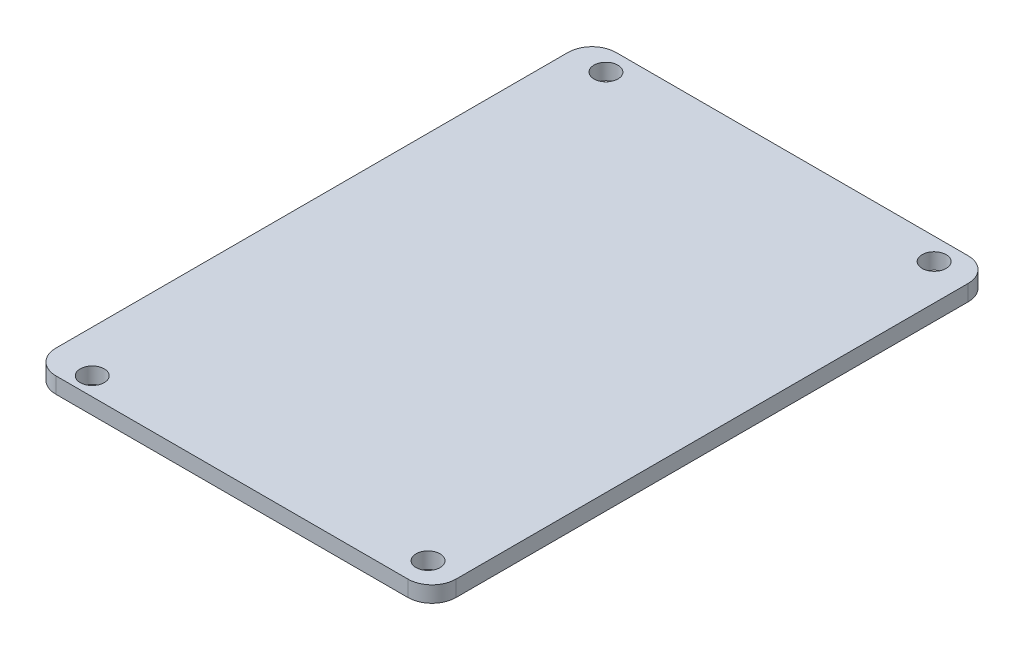
ISO-10303-21;
HEADER;
FILE_DESCRIPTION(('STEP AP214'),'2;1');
FILE_NAME('part.step','',(''),(''),'','','');
FILE_SCHEMA(('AUTOMOTIVE_DESIGN { 1 0 10303 214 1 1 1 1 }'));
ENDSEC;
DATA;
#1=APPLICATION_CONTEXT('core data for automotive mechanical design processes');
#2=APPLICATION_PROTOCOL_DEFINITION('international standard','automotive_design',2000,#1);
#3=PRODUCT_CONTEXT('',#1,'mechanical');
#4=PRODUCT('Part','Part','',(#3));
#5=PRODUCT_RELATED_PRODUCT_CATEGORY('part','',(#4));
#6=PRODUCT_DEFINITION_FORMATION('','',#4);
#7=PRODUCT_DEFINITION_CONTEXT('part definition',#1,'design');
#8=PRODUCT_DEFINITION('design','',#6,#7);
#9=PRODUCT_DEFINITION_SHAPE('','',#8);
#10=(LENGTH_UNIT() NAMED_UNIT(*) SI_UNIT(.MILLI.,.METRE.));
#11=(NAMED_UNIT(*) PLANE_ANGLE_UNIT() SI_UNIT($,.RADIAN.));
#12=(NAMED_UNIT(*) SI_UNIT($,.STERADIAN.) SOLID_ANGLE_UNIT());
#13=UNCERTAINTY_MEASURE_WITH_UNIT(LENGTH_MEASURE(1.E-05),#10,'distance_accuracy_value','');
#14=(GEOMETRIC_REPRESENTATION_CONTEXT(3) GLOBAL_UNCERTAINTY_ASSIGNED_CONTEXT((#13)) GLOBAL_UNIT_ASSIGNED_CONTEXT((#10,
#11,#12)) REPRESENTATION_CONTEXT('',''));
#15=CARTESIAN_POINT('',(0.,0.,0.));
#16=DIRECTION('',(0.,0.,1.));
#17=DIRECTION('',(1.,0.,0.));
#18=AXIS2_PLACEMENT_3D('',#15,#16,#17);
#19=CARTESIAN_POINT('',(0.,2.,0.));
#20=DIRECTION('',(0.,-1.,0.));
#21=DIRECTION('',(0.,0.,-1.));
#22=AXIS2_PLACEMENT_3D('',#19,#20,#21);
#23=PLANE('',#22);
#24=DIRECTION('',(-1.,0.,0.));
#25=VECTOR('',#24,1.);
#26=CARTESIAN_POINT('',(-25.,2.,-35.));
#27=LINE('',#26,#25);
#28=CARTESIAN_POINT('',(22.,2.,-35.));
#29=VERTEX_POINT('',#28);
#30=CARTESIAN_POINT('',(-22.,2.,-35.));
#31=VERTEX_POINT('',#30);
#32=EDGE_CURVE('E170',#29,#31,#27,.T.);
#33=ORIENTED_EDGE('',*,*,#32,.T.);
#34=CARTESIAN_POINT('',(-22.,2.,-32.));
#35=DIRECTION('',(0.,-1.,0.));
#36=DIRECTION('',(0.,0.,-1.));
#37=AXIS2_PLACEMENT_3D('',#34,#35,#36);
#38=CIRCLE('',#37,3.);
#39=CARTESIAN_POINT('',(-25.,2.,-32.));
#40=VERTEX_POINT('',#39);
#41=EDGE_CURVE('E150',#31,#40,#38,.F.);
#42=ORIENTED_EDGE('',*,*,#41,.T.);
#43=DIRECTION('',(0.,0.,1.));
#44=VECTOR('',#43,1.);
#45=CARTESIAN_POINT('',(-25.,2.,35.));
#46=LINE('',#45,#44);
#47=CARTESIAN_POINT('',(-25.,2.,32.));
#48=VERTEX_POINT('',#47);
#49=EDGE_CURVE('E120',#40,#48,#46,.T.);
#50=ORIENTED_EDGE('',*,*,#49,.T.);
#51=CARTESIAN_POINT('',(-22.,2.,32.));
#52=DIRECTION('',(0.,-1.,0.));
#53=DIRECTION('',(0.,0.,-1.));
#54=AXIS2_PLACEMENT_3D('',#51,#52,#53);
#55=CIRCLE('',#54,3.);
#56=CARTESIAN_POINT('',(-22.,2.,35.));
#57=VERTEX_POINT('',#56);
#58=EDGE_CURVE('E56',#48,#57,#55,.F.);
#59=ORIENTED_EDGE('',*,*,#58,.T.);
#60=DIRECTION('',(1.,0.,0.));
#61=VECTOR('',#60,1.);
#62=CARTESIAN_POINT('',(-25.,2.,35.));
#63=LINE('',#62,#61);
#64=CARTESIAN_POINT('',(22.,2.,35.));
#65=VERTEX_POINT('',#64);
#66=EDGE_CURVE('E137',#57,#65,#63,.T.);
#67=ORIENTED_EDGE('',*,*,#66,.T.);
#68=CARTESIAN_POINT('',(22.,2.,32.));
#69=DIRECTION('',(0.,-1.,0.));
#70=DIRECTION('',(0.,0.,-1.));
#71=AXIS2_PLACEMENT_3D('',#68,#69,#70);
#72=CIRCLE('',#71,3.);
#73=CARTESIAN_POINT('',(25.,2.,32.));
#74=VERTEX_POINT('',#73);
#75=EDGE_CURVE('E145',#65,#74,#72,.F.);
#76=ORIENTED_EDGE('',*,*,#75,.T.);
#77=DIRECTION('',(0.,0.,-1.));
#78=VECTOR('',#77,1.);
#79=CARTESIAN_POINT('',(25.,2.,35.));
#80=LINE('',#79,#78);
#81=CARTESIAN_POINT('',(25.,2.,-32.));
#82=VERTEX_POINT('',#81);
#83=EDGE_CURVE('E131',#74,#82,#80,.T.);
#84=ORIENTED_EDGE('',*,*,#83,.T.);
#85=CARTESIAN_POINT('',(22.,2.,-32.));
#86=DIRECTION('',(0.,-1.,0.));
#87=DIRECTION('',(0.,0.,-1.));
#88=AXIS2_PLACEMENT_3D('',#85,#86,#87);
#89=CIRCLE('',#88,3.);
#90=EDGE_CURVE('E148',#82,#29,#89,.F.);
#91=ORIENTED_EDGE('',*,*,#90,.T.);
#92=EDGE_LOOP('',(#33,#42,#50,#59,#67,#76,#84,#91));
#93=FACE_BOUND('',#92,.T.);
#94=CARTESIAN_POINT('',(20.5057121619149,2.,-32.2464785853898));
#95=DIRECTION('',(0.,1.,0.));
#96=DIRECTION('',(0.,0.,1.));
#97=AXIS2_PLACEMENT_3D('',#94,#95,#96);
#98=CIRCLE('',#97,1.5);
#99=CARTESIAN_POINT('',(20.5057121619149,2.,-30.7464785853898));
#100=VERTEX_POINT('',#99);
#101=EDGE_CURVE('E176',#100,#100,#98,.T.);
#102=ORIENTED_EDGE('',*,*,#101,.F.);
#103=EDGE_LOOP('',(#102));
#104=FACE_BOUND('',#103,.T.);
#105=CARTESIAN_POINT('',(-20.5057121619149,2.,-32.2464785853898));
#106=DIRECTION('',(0.,1.,0.));
#107=DIRECTION('',(0.,0.,-1.));
#108=AXIS2_PLACEMENT_3D('',#105,#106,#107);
#109=CIRCLE('',#108,1.5);
#110=CARTESIAN_POINT('',(-20.5057121619149,2.,-33.7464785853898));
#111=VERTEX_POINT('',#110);
#112=EDGE_CURVE('E185',#111,#111,#109,.T.);
#113=ORIENTED_EDGE('',*,*,#112,.F.);
#114=EDGE_LOOP('',(#113));
#115=FACE_BOUND('',#114,.T.);
#116=CARTESIAN_POINT('',(21.261079234065,2.,31.7535214146102));
#117=DIRECTION('',(0.,1.,0.));
#118=DIRECTION('',(0.,0.,-1.));
#119=AXIS2_PLACEMENT_3D('',#116,#117,#118);
#120=CIRCLE('',#119,1.5);
#121=CARTESIAN_POINT('',(21.261079234065,2.,30.2535214146102));
#122=VERTEX_POINT('',#121);
#123=EDGE_CURVE('E190',#122,#122,#120,.T.);
#124=ORIENTED_EDGE('',*,*,#123,.F.);
#125=EDGE_LOOP('',(#124));
#126=FACE_BOUND('',#125,.T.);
#127=CARTESIAN_POINT('',(-19.738920765935,2.,32.7214703126471));
#128=DIRECTION('',(0.,1.,0.));
#129=DIRECTION('',(0.,0.,1.));
#130=AXIS2_PLACEMENT_3D('',#127,#128,#129);
#131=CIRCLE('',#130,1.5);
#132=CARTESIAN_POINT('',(-19.738920765935,2.,34.2214703126471));
#133=VERTEX_POINT('',#132);
#134=EDGE_CURVE('E196',#133,#133,#131,.T.);
#135=ORIENTED_EDGE('',*,*,#134,.F.);
#136=EDGE_LOOP('',(#135));
#137=FACE_BOUND('',#136,.T.);
#138=ADVANCED_FACE('F35',(#93,#104,#115,#126,#137),#23,.F.);
#139=CARTESIAN_POINT('',(0.,0.,0.));
#140=DIRECTION('',(0.,-1.,0.));
#141=DIRECTION('',(0.,0.,-1.));
#142=AXIS2_PLACEMENT_3D('',#139,#140,#141);
#143=PLANE('',#142);
#144=CARTESIAN_POINT('',(21.261079234065,0.,31.7535214146102));
#145=DIRECTION('',(0.,1.,0.));
#146=DIRECTION('',(0.,0.,-1.));
#147=AXIS2_PLACEMENT_3D('',#144,#145,#146);
#148=CIRCLE('',#147,1.5);
#149=CARTESIAN_POINT('',(21.261079234065,0.,30.2535214146102));
#150=VERTEX_POINT('',#149);
#151=EDGE_CURVE('E193',#150,#150,#148,.T.);
#152=ORIENTED_EDGE('',*,*,#151,.T.);
#153=EDGE_LOOP('',(#152));
#154=FACE_BOUND('',#153,.T.);
#155=CARTESIAN_POINT('',(20.5057121619149,0.,-32.2464785853898));
#156=DIRECTION('',(0.,1.,0.));
#157=DIRECTION('',(0.,0.,1.));
#158=AXIS2_PLACEMENT_3D('',#155,#156,#157);
#159=CIRCLE('',#158,1.5);
#160=CARTESIAN_POINT('',(20.5057121619149,0.,-30.7464785853898));
#161=VERTEX_POINT('',#160);
#162=EDGE_CURVE('E178',#161,#161,#159,.T.);
#163=ORIENTED_EDGE('',*,*,#162,.T.);
#164=EDGE_LOOP('',(#163));
#165=FACE_BOUND('',#164,.T.);
#166=DIRECTION('',(0.,0.,1.));
#167=VECTOR('',#166,1.);
#168=CARTESIAN_POINT('',(-25.,0.,35.));
#169=LINE('',#168,#167);
#170=CARTESIAN_POINT('',(-25.,0.,-32.));
#171=VERTEX_POINT('',#170);
#172=CARTESIAN_POINT('',(-25.,0.,32.));
#173=VERTEX_POINT('',#172);
#174=EDGE_CURVE('E118',#171,#173,#169,.T.);
#175=ORIENTED_EDGE('',*,*,#174,.F.);
#176=CARTESIAN_POINT('',(-22.,0.,-32.));
#177=DIRECTION('',(0.,-1.,0.));
#178=DIRECTION('',(0.,0.,-1.));
#179=AXIS2_PLACEMENT_3D('',#176,#177,#178);
#180=CIRCLE('',#179,3.);
#181=CARTESIAN_POINT('',(-22.,0.,-35.));
#182=VERTEX_POINT('',#181);
#183=EDGE_CURVE('E101',#171,#182,#180,.T.);
#184=ORIENTED_EDGE('',*,*,#183,.T.);
#185=DIRECTION('',(-1.,0.,0.));
#186=VECTOR('',#185,1.);
#187=CARTESIAN_POINT('',(-25.,0.,-35.));
#188=LINE('',#187,#186);
#189=CARTESIAN_POINT('',(22.,0.,-35.));
#190=VERTEX_POINT('',#189);
#191=EDGE_CURVE('E129',#190,#182,#188,.T.);
#192=ORIENTED_EDGE('',*,*,#191,.F.);
#193=CARTESIAN_POINT('',(22.,0.,-32.));
#194=DIRECTION('',(0.,-1.,0.));
#195=DIRECTION('',(0.,0.,-1.));
#196=AXIS2_PLACEMENT_3D('',#193,#194,#195);
#197=CIRCLE('',#196,3.);
#198=CARTESIAN_POINT('',(25.,0.,-32.));
#199=VERTEX_POINT('',#198);
#200=EDGE_CURVE('E112',#190,#199,#197,.T.);
#201=ORIENTED_EDGE('',*,*,#200,.T.);
#202=DIRECTION('',(0.,0.,-1.));
#203=VECTOR('',#202,1.);
#204=CARTESIAN_POINT('',(25.,0.,35.));
#205=LINE('',#204,#203);
#206=CARTESIAN_POINT('',(25.,0.,32.));
#207=VERTEX_POINT('',#206);
#208=EDGE_CURVE('E133',#207,#199,#205,.T.);
#209=ORIENTED_EDGE('',*,*,#208,.F.);
#210=CARTESIAN_POINT('',(22.,0.,32.));
#211=DIRECTION('',(0.,-1.,0.));
#212=DIRECTION('',(0.,0.,-1.));
#213=AXIS2_PLACEMENT_3D('',#210,#211,#212);
#214=CIRCLE('',#213,3.);
#215=CARTESIAN_POINT('',(22.,0.,35.));
#216=VERTEX_POINT('',#215);
#217=EDGE_CURVE('E121',#207,#216,#214,.T.);
#218=ORIENTED_EDGE('',*,*,#217,.T.);
#219=DIRECTION('',(1.,0.,0.));
#220=VECTOR('',#219,1.);
#221=CARTESIAN_POINT('',(-25.,0.,35.));
#222=LINE('',#221,#220);
#223=CARTESIAN_POINT('',(-22.,0.,35.));
#224=VERTEX_POINT('',#223);
#225=EDGE_CURVE('E128',#224,#216,#222,.T.);
#226=ORIENTED_EDGE('',*,*,#225,.F.);
#227=CARTESIAN_POINT('',(-22.,0.,32.));
#228=DIRECTION('',(0.,-1.,0.));
#229=DIRECTION('',(0.,0.,-1.));
#230=AXIS2_PLACEMENT_3D('',#227,#228,#229);
#231=CIRCLE('',#230,3.);
#232=EDGE_CURVE('E127',#224,#173,#231,.T.);
#233=ORIENTED_EDGE('',*,*,#232,.T.);
#234=EDGE_LOOP('',(#175,#184,#192,#201,#209,#218,#226,#233));
#235=FACE_BOUND('',#234,.T.);
#236=CARTESIAN_POINT('',(-20.5057121619149,0.,-32.2464785853898));
#237=DIRECTION('',(0.,1.,0.));
#238=DIRECTION('',(0.,0.,-1.));
#239=AXIS2_PLACEMENT_3D('',#236,#237,#238);
#240=CIRCLE('',#239,1.5);
#241=CARTESIAN_POINT('',(-20.5057121619149,0.,-33.7464785853898));
#242=VERTEX_POINT('',#241);
#243=EDGE_CURVE('E187',#242,#242,#240,.T.);
#244=ORIENTED_EDGE('',*,*,#243,.T.);
#245=EDGE_LOOP('',(#244));
#246=FACE_BOUND('',#245,.T.);
#247=CARTESIAN_POINT('',(-19.738920765935,0.,32.7214703126471));
#248=DIRECTION('',(0.,1.,0.));
#249=DIRECTION('',(0.,0.,1.));
#250=AXIS2_PLACEMENT_3D('',#247,#248,#249);
#251=CIRCLE('',#250,1.5);
#252=CARTESIAN_POINT('',(-19.738920765935,0.,34.2214703126471));
#253=VERTEX_POINT('',#252);
#254=EDGE_CURVE('E199',#253,#253,#251,.T.);
#255=ORIENTED_EDGE('',*,*,#254,.T.);
#256=EDGE_LOOP('',(#255));
#257=FACE_BOUND('',#256,.T.);
#258=ADVANCED_FACE('F124',(#154,#165,#235,#246,#257),#143,.T.);
#259=CARTESIAN_POINT('',(25.,2.,35.));
#260=DIRECTION('',(-1.,0.,0.));
#261=DIRECTION('',(0.,0.,1.));
#262=AXIS2_PLACEMENT_3D('',#259,#260,#261);
#263=PLANE('',#262);
#264=ORIENTED_EDGE('',*,*,#208,.T.);
#265=DIRECTION('',(0.,-1.,0.));
#266=VECTOR('',#265,1.);
#267=CARTESIAN_POINT('',(25.,2.,-32.));
#268=LINE('',#267,#266);
#269=EDGE_CURVE('E155',#199,#82,#268,.F.);
#270=ORIENTED_EDGE('',*,*,#269,.T.);
#271=ORIENTED_EDGE('',*,*,#83,.F.);
#272=DIRECTION('',(0.,-1.,0.));
#273=VECTOR('',#272,1.);
#274=CARTESIAN_POINT('',(25.,2.,32.));
#275=LINE('',#274,#273);
#276=EDGE_CURVE('E152',#74,#207,#275,.T.);
#277=ORIENTED_EDGE('',*,*,#276,.T.);
#278=EDGE_LOOP('',(#264,#270,#271,#277));
#279=FACE_BOUND('',#278,.T.);
#280=ADVANCED_FACE('F161',(#279),#263,.F.);
#281=CARTESIAN_POINT('',(-25.,2.,-35.));
#282=DIRECTION('',(0.,0.,1.));
#283=DIRECTION('',(1.,0.,0.));
#284=AXIS2_PLACEMENT_3D('',#281,#282,#283);
#285=PLANE('',#284);
#286=ORIENTED_EDGE('',*,*,#191,.T.);
#287=DIRECTION('',(0.,-1.,0.));
#288=VECTOR('',#287,1.);
#289=CARTESIAN_POINT('',(-22.,2.,-35.));
#290=LINE('',#289,#288);
#291=EDGE_CURVE('E106',#182,#31,#290,.F.);
#292=ORIENTED_EDGE('',*,*,#291,.T.);
#293=ORIENTED_EDGE('',*,*,#32,.F.);
#294=DIRECTION('',(0.,-1.,0.));
#295=VECTOR('',#294,1.);
#296=CARTESIAN_POINT('',(22.,2.,-35.));
#297=LINE('',#296,#295);
#298=EDGE_CURVE('E111',#29,#190,#297,.T.);
#299=ORIENTED_EDGE('',*,*,#298,.T.);
#300=EDGE_LOOP('',(#286,#292,#293,#299));
#301=FACE_BOUND('',#300,.T.);
#302=ADVANCED_FACE('F175',(#301),#285,.F.);
#303=CARTESIAN_POINT('',(-25.,2.,35.));
#304=DIRECTION('',(1.,0.,0.));
#305=DIRECTION('',(0.,0.,-1.));
#306=AXIS2_PLACEMENT_3D('',#303,#304,#305);
#307=PLANE('',#306);
#308=ORIENTED_EDGE('',*,*,#49,.F.);
#309=DIRECTION('',(0.,-1.,0.));
#310=VECTOR('',#309,1.);
#311=CARTESIAN_POINT('',(-25.,2.,-32.));
#312=LINE('',#311,#310);
#313=EDGE_CURVE('E105',#40,#171,#312,.T.);
#314=ORIENTED_EDGE('',*,*,#313,.T.);
#315=ORIENTED_EDGE('',*,*,#174,.T.);
#316=DIRECTION('',(0.,-1.,0.));
#317=VECTOR('',#316,1.);
#318=CARTESIAN_POINT('',(-25.,2.,32.));
#319=LINE('',#318,#317);
#320=EDGE_CURVE('E122',#173,#48,#319,.F.);
#321=ORIENTED_EDGE('',*,*,#320,.T.);
#322=EDGE_LOOP('',(#308,#314,#315,#321));
#323=FACE_BOUND('',#322,.T.);
#324=ADVANCED_FACE('F117',(#323),#307,.F.);
#325=CARTESIAN_POINT('',(-25.,2.,35.));
#326=DIRECTION('',(0.,0.,-1.));
#327=DIRECTION('',(-1.,0.,0.));
#328=AXIS2_PLACEMENT_3D('',#325,#326,#327);
#329=PLANE('',#328);
#330=ORIENTED_EDGE('',*,*,#66,.F.);
#331=DIRECTION('',(0.,-1.,0.));
#332=VECTOR('',#331,1.);
#333=CARTESIAN_POINT('',(-22.,2.,35.));
#334=LINE('',#333,#332);
#335=EDGE_CURVE('E11',#57,#224,#334,.T.);
#336=ORIENTED_EDGE('',*,*,#335,.T.);
#337=ORIENTED_EDGE('',*,*,#225,.T.);
#338=DIRECTION('',(0.,-1.,0.));
#339=VECTOR('',#338,1.);
#340=CARTESIAN_POINT('',(22.,2.,35.));
#341=LINE('',#340,#339);
#342=EDGE_CURVE('E43',#216,#65,#341,.F.);
#343=ORIENTED_EDGE('',*,*,#342,.T.);
#344=EDGE_LOOP('',(#330,#336,#337,#343));
#345=FACE_BOUND('',#344,.T.);
#346=ADVANCED_FACE('F219',(#345),#329,.F.);
#347=CARTESIAN_POINT('',(20.5057121619149,2.,-32.2464785853898));
#348=DIRECTION('',(0.,-1.,0.));
#349=DIRECTION('',(0.,0.,-1.));
#350=AXIS2_PLACEMENT_3D('',#347,#348,#349);
#351=CYLINDRICAL_SURFACE('',#350,1.5);
#352=ORIENTED_EDGE('',*,*,#101,.T.);
#353=EDGE_LOOP('',(#352));
#354=FACE_BOUND('',#353,.T.);
#355=ORIENTED_EDGE('',*,*,#162,.F.);
#356=EDGE_LOOP('',(#355));
#357=FACE_BOUND('',#356,.T.);
#358=ADVANCED_FACE('F216',(#354,#357),#351,.F.);
#359=CARTESIAN_POINT('',(-20.5057121619149,2.,-32.2464785853898));
#360=DIRECTION('',(0.,-1.,0.));
#361=DIRECTION('',(0.,0.,-1.));
#362=AXIS2_PLACEMENT_3D('',#359,#360,#361);
#363=CYLINDRICAL_SURFACE('',#362,1.5);
#364=ORIENTED_EDGE('',*,*,#112,.T.);
#365=EDGE_LOOP('',(#364));
#366=FACE_BOUND('',#365,.T.);
#367=ORIENTED_EDGE('',*,*,#243,.F.);
#368=EDGE_LOOP('',(#367));
#369=FACE_BOUND('',#368,.T.);
#370=ADVANCED_FACE('F311',(#366,#369),#363,.F.);
#371=CARTESIAN_POINT('',(21.261079234065,2.,31.7535214146102));
#372=DIRECTION('',(0.,-1.,0.));
#373=DIRECTION('',(0.,0.,-1.));
#374=AXIS2_PLACEMENT_3D('',#371,#372,#373);
#375=CYLINDRICAL_SURFACE('',#374,1.5);
#376=ORIENTED_EDGE('',*,*,#123,.T.);
#377=EDGE_LOOP('',(#376));
#378=FACE_BOUND('',#377,.T.);
#379=ORIENTED_EDGE('',*,*,#151,.F.);
#380=EDGE_LOOP('',(#379));
#381=FACE_BOUND('',#380,.T.);
#382=ADVANCED_FACE('F302',(#378,#381),#375,.F.);
#383=CARTESIAN_POINT('',(-19.738920765935,2.,32.7214703126471));
#384=DIRECTION('',(0.,-1.,0.));
#385=DIRECTION('',(0.,0.,-1.));
#386=AXIS2_PLACEMENT_3D('',#383,#384,#385);
#387=CYLINDRICAL_SURFACE('',#386,1.5);
#388=ORIENTED_EDGE('',*,*,#134,.T.);
#389=EDGE_LOOP('',(#388));
#390=FACE_BOUND('',#389,.T.);
#391=ORIENTED_EDGE('',*,*,#254,.F.);
#392=EDGE_LOOP('',(#391));
#393=FACE_BOUND('',#392,.T.);
#394=ADVANCED_FACE('F205',(#390,#393),#387,.F.);
#395=CARTESIAN_POINT('',(-22.,2.,-32.));
#396=DIRECTION('',(0.,-1.,0.));
#397=DIRECTION('',(0.,0.,-1.));
#398=AXIS2_PLACEMENT_3D('',#395,#396,#397);
#399=CYLINDRICAL_SURFACE('',#398,3.);
#400=ORIENTED_EDGE('',*,*,#41,.F.);
#401=ORIENTED_EDGE('',*,*,#291,.F.);
#402=ORIENTED_EDGE('',*,*,#183,.F.);
#403=ORIENTED_EDGE('',*,*,#313,.F.);
#404=EDGE_LOOP('',(#400,#401,#402,#403));
#405=FACE_BOUND('',#404,.T.);
#406=ADVANCED_FACE('F104',(#405),#399,.T.);
#407=CARTESIAN_POINT('',(22.,2.,-32.));
#408=DIRECTION('',(0.,-1.,0.));
#409=DIRECTION('',(0.,0.,-1.));
#410=AXIS2_PLACEMENT_3D('',#407,#408,#409);
#411=CYLINDRICAL_SURFACE('',#410,3.);
#412=ORIENTED_EDGE('',*,*,#90,.F.);
#413=ORIENTED_EDGE('',*,*,#269,.F.);
#414=ORIENTED_EDGE('',*,*,#200,.F.);
#415=ORIENTED_EDGE('',*,*,#298,.F.);
#416=EDGE_LOOP('',(#412,#413,#414,#415));
#417=FACE_BOUND('',#416,.T.);
#418=ADVANCED_FACE('F173',(#417),#411,.T.);
#419=CARTESIAN_POINT('',(-22.,2.,32.));
#420=DIRECTION('',(0.,-1.,0.));
#421=DIRECTION('',(0.,0.,-1.));
#422=AXIS2_PLACEMENT_3D('',#419,#420,#421);
#423=CYLINDRICAL_SURFACE('',#422,3.);
#424=ORIENTED_EDGE('',*,*,#58,.F.);
#425=ORIENTED_EDGE('',*,*,#320,.F.);
#426=ORIENTED_EDGE('',*,*,#232,.F.);
#427=ORIENTED_EDGE('',*,*,#335,.F.);
#428=EDGE_LOOP('',(#424,#425,#426,#427));
#429=FACE_BOUND('',#428,.T.);
#430=ADVANCED_FACE('F231',(#429),#423,.T.);
#431=CARTESIAN_POINT('',(22.,2.,32.));
#432=DIRECTION('',(0.,-1.,0.));
#433=DIRECTION('',(0.,0.,-1.));
#434=AXIS2_PLACEMENT_3D('',#431,#432,#433);
#435=CYLINDRICAL_SURFACE('',#434,3.);
#436=ORIENTED_EDGE('',*,*,#75,.F.);
#437=ORIENTED_EDGE('',*,*,#342,.F.);
#438=ORIENTED_EDGE('',*,*,#217,.F.);
#439=ORIENTED_EDGE('',*,*,#276,.F.);
#440=EDGE_LOOP('',(#436,#437,#438,#439));
#441=FACE_BOUND('',#440,.T.);
#442=ADVANCED_FACE('F37',(#441),#435,.T.);
#443=CLOSED_SHELL('',(#138,#258,#280,#302,#324,#346,#358,#370,#382,#394,#406,#418,#430,#442));
#444=MANIFOLD_SOLID_BREP('B2',#443);
#445=ADVANCED_BREP_SHAPE_REPRESENTATION('',(#18,#444),#14);
#446=SHAPE_DEFINITION_REPRESENTATION(#9,#445);
ENDSEC;
END-ISO-10303-21;
